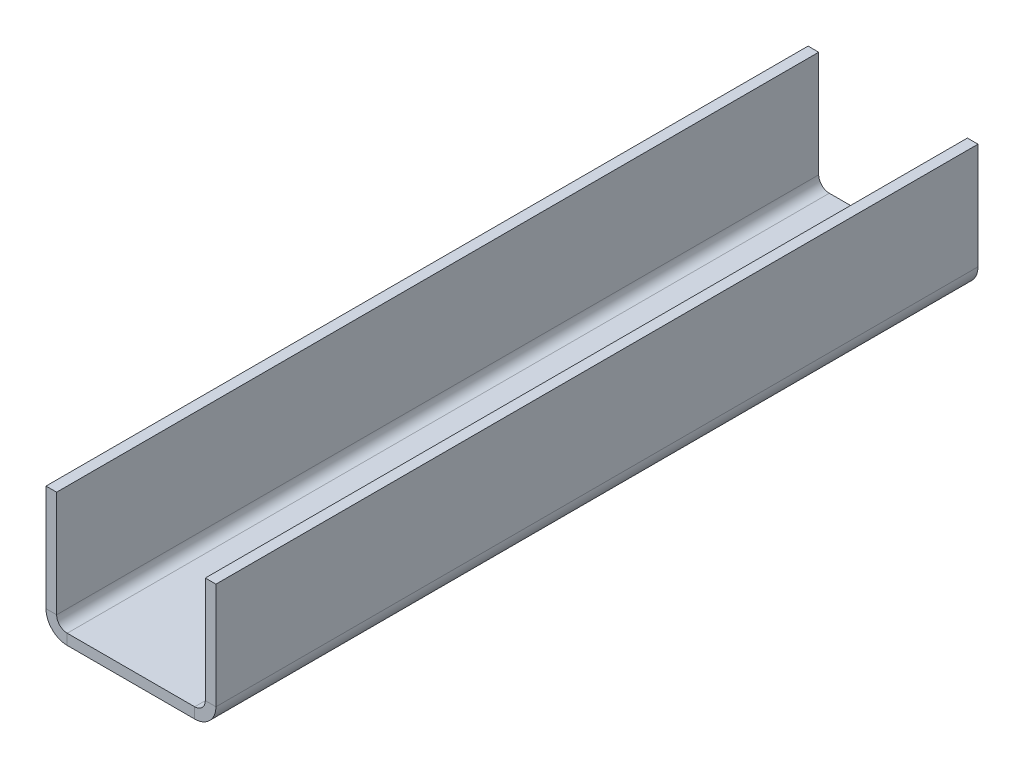
ISO-10303-21;
HEADER;
FILE_DESCRIPTION(('STEP AP214'),'2;1');
FILE_NAME('part.step','',(''),(''),'','','');
FILE_SCHEMA(('AUTOMOTIVE_DESIGN { 1 0 10303 214 1 1 1 1 }'));
ENDSEC;
DATA;
#1=APPLICATION_CONTEXT('core data for automotive mechanical design processes');
#2=APPLICATION_PROTOCOL_DEFINITION('international standard','automotive_design',2000,#1);
#3=PRODUCT_CONTEXT('',#1,'mechanical');
#4=PRODUCT('Part','Part','',(#3));
#5=PRODUCT_RELATED_PRODUCT_CATEGORY('part','',(#4));
#6=PRODUCT_DEFINITION_FORMATION('','',#4);
#7=PRODUCT_DEFINITION_CONTEXT('part definition',#1,'design');
#8=PRODUCT_DEFINITION('design','',#6,#7);
#9=PRODUCT_DEFINITION_SHAPE('','',#8);
#10=(LENGTH_UNIT() NAMED_UNIT(*) SI_UNIT(.MILLI.,.METRE.));
#11=(NAMED_UNIT(*) PLANE_ANGLE_UNIT() SI_UNIT($,.RADIAN.));
#12=(NAMED_UNIT(*) SI_UNIT($,.STERADIAN.) SOLID_ANGLE_UNIT());
#13=UNCERTAINTY_MEASURE_WITH_UNIT(LENGTH_MEASURE(1.E-05),#10,'distance_accuracy_value','');
#14=(GEOMETRIC_REPRESENTATION_CONTEXT(3) GLOBAL_UNCERTAINTY_ASSIGNED_CONTEXT((#13)) GLOBAL_UNIT_ASSIGNED_CONTEXT((#10,
#11,#12)) REPRESENTATION_CONTEXT('',''));
#15=CARTESIAN_POINT('',(0.,0.,0.));
#16=DIRECTION('',(0.,0.,1.));
#17=DIRECTION('',(1.,0.,0.));
#18=AXIS2_PLACEMENT_3D('',#15,#16,#17);
#19=CARTESIAN_POINT('',(0.,6.35,227.838));
#20=DIRECTION('',(0.,0.,1.));
#21=DIRECTION('',(1.,0.,0.));
#22=AXIS2_PLACEMENT_3D('',#19,#20,#21);
#23=PLANE('',#22);
#24=DIRECTION('',(1.,0.,0.));
#25=VECTOR('',#24,1.);
#26=CARTESIAN_POINT('',(0.,6.35,227.838));
#27=LINE('',#26,#25);
#28=CARTESIAN_POINT('',(0.,6.35,227.838));
#29=VERTEX_POINT('',#28);
#30=CARTESIAN_POINT('',(3.175,6.35,227.838));
#31=VERTEX_POINT('',#30);
#32=EDGE_CURVE('E11',#29,#31,#27,.T.);
#33=ORIENTED_EDGE('',*,*,#32,.F.);
#34=CARTESIAN_POINT('',(6.35,6.35,227.838));
#35=DIRECTION('',(0.,0.,-1.));
#36=DIRECTION('',(-1.,0.,0.));
#37=AXIS2_PLACEMENT_3D('',#34,#35,#36);
#38=CIRCLE('',#37,6.35);
#39=CARTESIAN_POINT('',(6.35,0.,227.838));
#40=VERTEX_POINT('',#39);
#41=EDGE_CURVE('E147',#29,#40,#38,.F.);
#42=ORIENTED_EDGE('',*,*,#41,.T.);
#43=DIRECTION('',(0.,-1.,0.));
#44=VECTOR('',#43,1.);
#45=CARTESIAN_POINT('',(6.35,3.175,227.838));
#46=LINE('',#45,#44);
#47=CARTESIAN_POINT('',(6.35,3.175,227.838));
#48=VERTEX_POINT('',#47);
#49=EDGE_CURVE('E45',#48,#40,#46,.T.);
#50=ORIENTED_EDGE('',*,*,#49,.F.);
#51=CARTESIAN_POINT('',(6.35,6.35,227.838));
#52=DIRECTION('',(0.,0.,1.));
#53=DIRECTION('',(1.,0.,0.));
#54=AXIS2_PLACEMENT_3D('',#51,#52,#53);
#55=CIRCLE('',#54,3.175);
#56=EDGE_CURVE('E241',#31,#48,#55,.T.);
#57=ORIENTED_EDGE('',*,*,#56,.F.);
#58=EDGE_LOOP('',(#33,#42,#50,#57));
#59=FACE_BOUND('',#58,.T.);
#60=ADVANCED_FACE('F37',(#59),#23,.T.);
#61=CARTESIAN_POINT('',(6.35,3.175,227.838));
#62=DIRECTION('',(0.,0.,1.));
#63=DIRECTION('',(1.,0.,0.));
#64=AXIS2_PLACEMENT_3D('',#61,#62,#63);
#65=PLANE('',#64);
#66=DIRECTION('',(0.,-1.,0.));
#67=VECTOR('',#66,1.);
#68=CARTESIAN_POINT('',(0.,0.,227.838));
#69=LINE('',#68,#67);
#70=CARTESIAN_POINT('',(0.,38.1,227.838));
#71=VERTEX_POINT('',#70);
#72=EDGE_CURVE('E152',#71,#29,#69,.T.);
#73=ORIENTED_EDGE('',*,*,#72,.T.);
#74=ORIENTED_EDGE('',*,*,#32,.T.);
#75=DIRECTION('',(0.,1.,0.));
#76=VECTOR('',#75,1.);
#77=CARTESIAN_POINT('',(3.175,0.,227.838));
#78=LINE('',#77,#76);
#79=CARTESIAN_POINT('',(3.175,38.1,227.838));
#80=VERTEX_POINT('',#79);
#81=EDGE_CURVE('E254',#80,#31,#78,.F.);
#82=ORIENTED_EDGE('',*,*,#81,.F.);
#83=DIRECTION('',(1.,0.,0.));
#84=VECTOR('',#83,1.);
#85=CARTESIAN_POINT('',(0.,38.1,227.838));
#86=LINE('',#85,#84);
#87=EDGE_CURVE('E256',#71,#80,#86,.T.);
#88=ORIENTED_EDGE('',*,*,#87,.F.);
#89=EDGE_LOOP('',(#73,#74,#82,#88));
#90=FACE_BOUND('',#89,.T.);
#91=ADVANCED_FACE('F267',(#90),#65,.T.);
#92=CARTESIAN_POINT('',(6.35,0.,0.));
#93=DIRECTION('',(0.,0.,-1.));
#94=DIRECTION('',(-1.,0.,0.));
#95=AXIS2_PLACEMENT_3D('',#92,#93,#94);
#96=PLANE('',#95);
#97=DIRECTION('',(0.,1.,0.));
#98=VECTOR('',#97,1.);
#99=CARTESIAN_POINT('',(6.35,0.,0.));
#100=LINE('',#99,#98);
#101=CARTESIAN_POINT('',(6.35,0.,0.));
#102=VERTEX_POINT('',#101);
#103=CARTESIAN_POINT('',(6.35,3.175,0.));
#104=VERTEX_POINT('',#103);
#105=EDGE_CURVE('E145',#102,#104,#100,.T.);
#106=ORIENTED_EDGE('',*,*,#105,.F.);
#107=CARTESIAN_POINT('',(6.35,6.35,0.));
#108=DIRECTION('',(0.,0.,-1.));
#109=DIRECTION('',(-1.,0.,0.));
#110=AXIS2_PLACEMENT_3D('',#107,#108,#109);
#111=CIRCLE('',#110,6.35);
#112=CARTESIAN_POINT('',(0.,6.35,0.));
#113=VERTEX_POINT('',#112);
#114=EDGE_CURVE('E159',#113,#102,#111,.F.);
#115=ORIENTED_EDGE('',*,*,#114,.F.);
#116=DIRECTION('',(-1.,0.,0.));
#117=VECTOR('',#116,1.);
#118=CARTESIAN_POINT('',(3.175,6.35,0.));
#119=LINE('',#118,#117);
#120=CARTESIAN_POINT('',(3.175,6.35,0.));
#121=VERTEX_POINT('',#120);
#122=EDGE_CURVE('E232',#121,#113,#119,.T.);
#123=ORIENTED_EDGE('',*,*,#122,.F.);
#124=CARTESIAN_POINT('',(6.35,6.35,0.));
#125=DIRECTION('',(0.,0.,1.));
#126=DIRECTION('',(1.,0.,0.));
#127=AXIS2_PLACEMENT_3D('',#124,#125,#126);
#128=CIRCLE('',#127,3.175);
#129=EDGE_CURVE('E186',#121,#104,#128,.T.);
#130=ORIENTED_EDGE('',*,*,#129,.T.);
#131=EDGE_LOOP('',(#106,#115,#123,#130));
#132=FACE_BOUND('',#131,.T.);
#133=ADVANCED_FACE('F246',(#132),#96,.T.);
#134=CARTESIAN_POINT('',(3.175,6.35,0.));
#135=DIRECTION('',(0.,0.,-1.));
#136=DIRECTION('',(-1.,0.,0.));
#137=AXIS2_PLACEMENT_3D('',#134,#135,#136);
#138=PLANE('',#137);
#139=DIRECTION('',(1.,0.,0.));
#140=VECTOR('',#139,1.);
#141=CARTESIAN_POINT('',(0.,0.,0.));
#142=LINE('',#141,#140);
#143=CARTESIAN_POINT('',(44.45,0.,0.));
#144=VERTEX_POINT('',#143);
#145=EDGE_CURVE('E199',#102,#144,#142,.T.);
#146=ORIENTED_EDGE('',*,*,#145,.F.);
#147=ORIENTED_EDGE('',*,*,#105,.T.);
#148=DIRECTION('',(1.,0.,0.));
#149=VECTOR('',#148,1.);
#150=CARTESIAN_POINT('',(0.,3.175,0.));
#151=LINE('',#150,#149);
#152=CARTESIAN_POINT('',(44.45,3.175,0.));
#153=VERTEX_POINT('',#152);
#154=EDGE_CURVE('E184',#104,#153,#151,.T.);
#155=ORIENTED_EDGE('',*,*,#154,.T.);
#156=DIRECTION('',(0.,-1.,0.));
#157=VECTOR('',#156,1.);
#158=CARTESIAN_POINT('',(44.45,3.175,0.));
#159=LINE('',#158,#157);
#160=EDGE_CURVE('E94',#153,#144,#159,.T.);
#161=ORIENTED_EDGE('',*,*,#160,.T.);
#162=EDGE_LOOP('',(#146,#147,#155,#161));
#163=FACE_BOUND('',#162,.T.);
#164=ADVANCED_FACE('F234',(#163),#138,.T.);
#165=CARTESIAN_POINT('',(44.45,0.,227.838));
#166=DIRECTION('',(0.,0.,1.));
#167=DIRECTION('',(1.,0.,0.));
#168=AXIS2_PLACEMENT_3D('',#165,#166,#167);
#169=PLANE('',#168);
#170=DIRECTION('',(0.,1.,0.));
#171=VECTOR('',#170,1.);
#172=CARTESIAN_POINT('',(44.45,0.,227.838));
#173=LINE('',#172,#171);
#174=CARTESIAN_POINT('',(44.45,0.,227.838));
#175=VERTEX_POINT('',#174);
#176=CARTESIAN_POINT('',(44.45,3.175,227.838));
#177=VERTEX_POINT('',#176);
#178=EDGE_CURVE('E230',#175,#177,#173,.T.);
#179=ORIENTED_EDGE('',*,*,#178,.F.);
#180=CARTESIAN_POINT('',(44.45,6.35,227.838));
#181=DIRECTION('',(0.,0.,-1.));
#182=DIRECTION('',(-1.,0.,0.));
#183=AXIS2_PLACEMENT_3D('',#180,#181,#182);
#184=CIRCLE('',#183,6.35);
#185=CARTESIAN_POINT('',(50.8,6.35,227.838));
#186=VERTEX_POINT('',#185);
#187=EDGE_CURVE('E167',#175,#186,#184,.F.);
#188=ORIENTED_EDGE('',*,*,#187,.T.);
#189=DIRECTION('',(1.,0.,0.));
#190=VECTOR('',#189,1.);
#191=CARTESIAN_POINT('',(47.625,6.35,227.838));
#192=LINE('',#191,#190);
#193=CARTESIAN_POINT('',(47.625,6.35,227.838));
#194=VERTEX_POINT('',#193);
#195=EDGE_CURVE('E53',#194,#186,#192,.T.);
#196=ORIENTED_EDGE('',*,*,#195,.F.);
#197=CARTESIAN_POINT('',(44.45,6.35,227.838));
#198=DIRECTION('',(0.,0.,1.));
#199=DIRECTION('',(1.,0.,0.));
#200=AXIS2_PLACEMENT_3D('',#197,#198,#199);
#201=CIRCLE('',#200,3.175);
#202=EDGE_CURVE('E258',#177,#194,#201,.T.);
#203=ORIENTED_EDGE('',*,*,#202,.F.);
#204=EDGE_LOOP('',(#179,#188,#196,#203));
#205=FACE_BOUND('',#204,.T.);
#206=ADVANCED_FACE('F293',(#205),#169,.T.);
#207=CARTESIAN_POINT('',(47.625,6.35,227.838));
#208=DIRECTION('',(0.,0.,1.));
#209=DIRECTION('',(1.,0.,0.));
#210=AXIS2_PLACEMENT_3D('',#207,#208,#209);
#211=PLANE('',#210);
#212=DIRECTION('',(1.,0.,0.));
#213=VECTOR('',#212,1.);
#214=CARTESIAN_POINT('',(0.,0.,227.838));
#215=LINE('',#214,#213);
#216=EDGE_CURVE('E137',#40,#175,#215,.T.);
#217=ORIENTED_EDGE('',*,*,#216,.T.);
#218=ORIENTED_EDGE('',*,*,#178,.T.);
#219=DIRECTION('',(1.,0.,0.));
#220=VECTOR('',#219,1.);
#221=CARTESIAN_POINT('',(0.,3.175,227.838));
#222=LINE('',#221,#220);
#223=EDGE_CURVE('E140',#48,#177,#222,.T.);
#224=ORIENTED_EDGE('',*,*,#223,.F.);
#225=ORIENTED_EDGE('',*,*,#49,.T.);
#226=EDGE_LOOP('',(#217,#218,#224,#225));
#227=FACE_BOUND('',#226,.T.);
#228=ADVANCED_FACE('F135',(#227),#211,.T.);
#229=CARTESIAN_POINT('',(50.8,6.35,0.));
#230=DIRECTION('',(0.,0.,-1.));
#231=DIRECTION('',(-1.,0.,0.));
#232=AXIS2_PLACEMENT_3D('',#229,#230,#231);
#233=PLANE('',#232);
#234=DIRECTION('',(-1.,0.,0.));
#235=VECTOR('',#234,1.);
#236=CARTESIAN_POINT('',(50.8,6.35,0.));
#237=LINE('',#236,#235);
#238=CARTESIAN_POINT('',(50.8,6.35,0.));
#239=VERTEX_POINT('',#238);
#240=CARTESIAN_POINT('',(47.625,6.35,0.));
#241=VERTEX_POINT('',#240);
#242=EDGE_CURVE('E101',#239,#241,#237,.T.);
#243=ORIENTED_EDGE('',*,*,#242,.F.);
#244=CARTESIAN_POINT('',(44.45,6.35,0.));
#245=DIRECTION('',(0.,0.,-1.));
#246=DIRECTION('',(-1.,0.,0.));
#247=AXIS2_PLACEMENT_3D('',#244,#245,#246);
#248=CIRCLE('',#247,6.35);
#249=EDGE_CURVE('E201',#144,#239,#248,.F.);
#250=ORIENTED_EDGE('',*,*,#249,.F.);
#251=ORIENTED_EDGE('',*,*,#160,.F.);
#252=CARTESIAN_POINT('',(44.45,6.35,0.));
#253=DIRECTION('',(0.,0.,1.));
#254=DIRECTION('',(1.,0.,0.));
#255=AXIS2_PLACEMENT_3D('',#252,#253,#254);
#256=CIRCLE('',#255,3.175);
#257=EDGE_CURVE('E182',#153,#241,#256,.T.);
#258=ORIENTED_EDGE('',*,*,#257,.T.);
#259=EDGE_LOOP('',(#243,#250,#251,#258));
#260=FACE_BOUND('',#259,.T.);
#261=ADVANCED_FACE('F299',(#260),#233,.T.);
#262=CARTESIAN_POINT('',(44.45,3.175,0.));
#263=DIRECTION('',(0.,0.,-1.));
#264=DIRECTION('',(-1.,0.,0.));
#265=AXIS2_PLACEMENT_3D('',#262,#263,#264);
#266=PLANE('',#265);
#267=DIRECTION('',(0.,1.,0.));
#268=VECTOR('',#267,1.);
#269=CARTESIAN_POINT('',(50.8,0.,0.));
#270=LINE('',#269,#268);
#271=CARTESIAN_POINT('',(50.8,38.1,0.));
#272=VERTEX_POINT('',#271);
#273=EDGE_CURVE('E173',#239,#272,#270,.T.);
#274=ORIENTED_EDGE('',*,*,#273,.F.);
#275=ORIENTED_EDGE('',*,*,#242,.T.);
#276=DIRECTION('',(0.,1.,0.));
#277=VECTOR('',#276,1.);
#278=CARTESIAN_POINT('',(47.625,0.,0.));
#279=LINE('',#278,#277);
#280=CARTESIAN_POINT('',(47.625,38.1,0.));
#281=VERTEX_POINT('',#280);
#282=EDGE_CURVE('E179',#241,#281,#279,.T.);
#283=ORIENTED_EDGE('',*,*,#282,.T.);
#284=DIRECTION('',(1.,0.,0.));
#285=VECTOR('',#284,1.);
#286=CARTESIAN_POINT('',(47.625,38.1,0.));
#287=LINE('',#286,#285);
#288=EDGE_CURVE('E176',#281,#272,#287,.T.);
#289=ORIENTED_EDGE('',*,*,#288,.T.);
#290=EDGE_LOOP('',(#274,#275,#283,#289));
#291=FACE_BOUND('',#290,.T.);
#292=ADVANCED_FACE('F302',(#291),#266,.T.);
#293=CARTESIAN_POINT('',(50.8,0.,227.838));
#294=DIRECTION('',(-1.,0.,0.));
#295=DIRECTION('',(0.,0.,1.));
#296=AXIS2_PLACEMENT_3D('',#293,#294,#295);
#297=PLANE('',#296);
#298=ORIENTED_EDGE('',*,*,#273,.T.);
#299=DIRECTION('',(0.,0.,-1.));
#300=VECTOR('',#299,1.);
#301=CARTESIAN_POINT('',(50.8,38.1,227.838));
#302=LINE('',#301,#300);
#303=CARTESIAN_POINT('',(50.8,38.1,227.838));
#304=VERTEX_POINT('',#303);
#305=EDGE_CURVE('E225',#304,#272,#302,.T.);
#306=ORIENTED_EDGE('',*,*,#305,.F.);
#307=DIRECTION('',(0.,1.,0.));
#308=VECTOR('',#307,1.);
#309=CARTESIAN_POINT('',(50.8,0.,227.838));
#310=LINE('',#309,#308);
#311=EDGE_CURVE('E107',#186,#304,#310,.T.);
#312=ORIENTED_EDGE('',*,*,#311,.F.);
#313=DIRECTION('',(0.,0.,-1.));
#314=VECTOR('',#313,1.);
#315=CARTESIAN_POINT('',(50.8,6.35,227.838));
#316=LINE('',#315,#314);
#317=EDGE_CURVE('E169',#186,#239,#316,.T.);
#318=ORIENTED_EDGE('',*,*,#317,.T.);
#319=EDGE_LOOP('',(#298,#306,#312,#318));
#320=FACE_BOUND('',#319,.T.);
#321=ADVANCED_FACE('F305',(#320),#297,.F.);
#322=CARTESIAN_POINT('',(47.625,38.1,227.838));
#323=DIRECTION('',(0.,1.,0.));
#324=DIRECTION('',(0.,0.,1.));
#325=AXIS2_PLACEMENT_3D('',#322,#323,#324);
#326=PLANE('',#325);
#327=ORIENTED_EDGE('',*,*,#288,.F.);
#328=DIRECTION('',(0.,0.,-1.));
#329=VECTOR('',#328,1.);
#330=CARTESIAN_POINT('',(47.625,38.1,227.838));
#331=LINE('',#330,#329);
#332=CARTESIAN_POINT('',(47.625,38.1,227.838));
#333=VERTEX_POINT('',#332);
#334=EDGE_CURVE('E223',#333,#281,#331,.T.);
#335=ORIENTED_EDGE('',*,*,#334,.F.);
#336=DIRECTION('',(1.,0.,0.));
#337=VECTOR('',#336,1.);
#338=CARTESIAN_POINT('',(47.625,38.1,227.838));
#339=LINE('',#338,#337);
#340=EDGE_CURVE('E513',#333,#304,#339,.T.);
#341=ORIENTED_EDGE('',*,*,#340,.T.);
#342=ORIENTED_EDGE('',*,*,#305,.T.);
#343=EDGE_LOOP('',(#327,#335,#341,#342));
#344=FACE_BOUND('',#343,.T.);
#345=ADVANCED_FACE('F309',(#344),#326,.T.);
#346=CARTESIAN_POINT('',(47.625,0.,227.838));
#347=DIRECTION('',(-1.,0.,0.));
#348=DIRECTION('',(0.,0.,1.));
#349=AXIS2_PLACEMENT_3D('',#346,#347,#348);
#350=PLANE('',#349);
#351=ORIENTED_EDGE('',*,*,#282,.F.);
#352=DIRECTION('',(0.,0.,-1.));
#353=VECTOR('',#352,1.);
#354=CARTESIAN_POINT('',(47.625,6.35,227.838));
#355=LINE('',#354,#353);
#356=EDGE_CURVE('E220',#194,#241,#355,.T.);
#357=ORIENTED_EDGE('',*,*,#356,.F.);
#358=DIRECTION('',(0.,1.,0.));
#359=VECTOR('',#358,1.);
#360=CARTESIAN_POINT('',(47.625,0.,227.838));
#361=LINE('',#360,#359);
#362=EDGE_CURVE('E515',#194,#333,#361,.T.);
#363=ORIENTED_EDGE('',*,*,#362,.T.);
#364=ORIENTED_EDGE('',*,*,#334,.T.);
#365=EDGE_LOOP('',(#351,#357,#363,#364));
#366=FACE_BOUND('',#365,.T.);
#367=ADVANCED_FACE('F313',(#366),#350,.T.);
#368=CARTESIAN_POINT('',(44.45,6.35,227.838));
#369=DIRECTION('',(0.,0.,-1.));
#370=DIRECTION('',(-1.,0.,0.));
#371=AXIS2_PLACEMENT_3D('',#368,#369,#370);
#372=CYLINDRICAL_SURFACE('',#371,3.175);
#373=ORIENTED_EDGE('',*,*,#257,.F.);
#374=DIRECTION('',(0.,0.,-1.));
#375=VECTOR('',#374,1.);
#376=CARTESIAN_POINT('',(44.45,3.175,227.838));
#377=LINE('',#376,#375);
#378=EDGE_CURVE('E217',#177,#153,#377,.T.);
#379=ORIENTED_EDGE('',*,*,#378,.F.);
#380=ORIENTED_EDGE('',*,*,#202,.T.);
#381=ORIENTED_EDGE('',*,*,#356,.T.);
#382=EDGE_LOOP('',(#373,#379,#380,#381));
#383=FACE_BOUND('',#382,.T.);
#384=ADVANCED_FACE('F317',(#383),#372,.F.);
#385=CARTESIAN_POINT('',(0.,3.175,227.838));
#386=DIRECTION('',(0.,1.,0.));
#387=DIRECTION('',(0.,0.,1.));
#388=AXIS2_PLACEMENT_3D('',#385,#386,#387);
#389=PLANE('',#388);
#390=ORIENTED_EDGE('',*,*,#154,.F.);
#391=DIRECTION('',(0.,0.,-1.));
#392=VECTOR('',#391,1.);
#393=CARTESIAN_POINT('',(6.35,3.175,227.838));
#394=LINE('',#393,#392);
#395=EDGE_CURVE('E214',#48,#104,#394,.T.);
#396=ORIENTED_EDGE('',*,*,#395,.F.);
#397=ORIENTED_EDGE('',*,*,#223,.T.);
#398=ORIENTED_EDGE('',*,*,#378,.T.);
#399=EDGE_LOOP('',(#390,#396,#397,#398));
#400=FACE_BOUND('',#399,.T.);
#401=ADVANCED_FACE('F243',(#400),#389,.T.);
#402=CARTESIAN_POINT('',(6.35,6.35,227.838));
#403=DIRECTION('',(0.,0.,-1.));
#404=DIRECTION('',(-1.,0.,0.));
#405=AXIS2_PLACEMENT_3D('',#402,#403,#404);
#406=CYLINDRICAL_SURFACE('',#405,3.175);
#407=ORIENTED_EDGE('',*,*,#129,.F.);
#408=DIRECTION('',(0.,0.,-1.));
#409=VECTOR('',#408,1.);
#410=CARTESIAN_POINT('',(3.175,6.35,227.838));
#411=LINE('',#410,#409);
#412=EDGE_CURVE('E211',#31,#121,#411,.T.);
#413=ORIENTED_EDGE('',*,*,#412,.F.);
#414=ORIENTED_EDGE('',*,*,#56,.T.);
#415=ORIENTED_EDGE('',*,*,#395,.T.);
#416=EDGE_LOOP('',(#407,#413,#414,#415));
#417=FACE_BOUND('',#416,.T.);
#418=ADVANCED_FACE('F239',(#417),#406,.F.);
#419=CARTESIAN_POINT('',(3.175,0.,227.838));
#420=DIRECTION('',(1.,0.,0.));
#421=DIRECTION('',(0.,0.,-1.));
#422=AXIS2_PLACEMENT_3D('',#419,#420,#421);
#423=PLANE('',#422);
#424=DIRECTION('',(0.,1.,0.));
#425=VECTOR('',#424,1.);
#426=CARTESIAN_POINT('',(3.175,0.,0.));
#427=LINE('',#426,#425);
#428=CARTESIAN_POINT('',(3.175,38.1,0.));
#429=VERTEX_POINT('',#428);
#430=EDGE_CURVE('E189',#429,#121,#427,.F.);
#431=ORIENTED_EDGE('',*,*,#430,.F.);
#432=DIRECTION('',(0.,0.,-1.));
#433=VECTOR('',#432,1.);
#434=CARTESIAN_POINT('',(3.175,38.1,227.838));
#435=LINE('',#434,#433);
#436=EDGE_CURVE('E209',#80,#429,#435,.T.);
#437=ORIENTED_EDGE('',*,*,#436,.F.);
#438=ORIENTED_EDGE('',*,*,#81,.T.);
#439=ORIENTED_EDGE('',*,*,#412,.T.);
#440=EDGE_LOOP('',(#431,#437,#438,#439));
#441=FACE_BOUND('',#440,.T.);
#442=ADVANCED_FACE('F252',(#441),#423,.T.);
#443=CARTESIAN_POINT('',(0.,38.1,227.838));
#444=DIRECTION('',(0.,1.,0.));
#445=DIRECTION('',(0.,0.,1.));
#446=AXIS2_PLACEMENT_3D('',#443,#444,#445);
#447=PLANE('',#446);
#448=DIRECTION('',(1.,0.,0.));
#449=VECTOR('',#448,1.);
#450=CARTESIAN_POINT('',(0.,38.1,0.));
#451=LINE('',#450,#449);
#452=CARTESIAN_POINT('',(0.,38.1,0.));
#453=VERTEX_POINT('',#452);
#454=EDGE_CURVE('E192',#453,#429,#451,.T.);
#455=ORIENTED_EDGE('',*,*,#454,.F.);
#456=DIRECTION('',(0.,0.,-1.));
#457=VECTOR('',#456,1.);
#458=CARTESIAN_POINT('',(0.,38.1,227.838));
#459=LINE('',#458,#457);
#460=EDGE_CURVE('E207',#71,#453,#459,.T.);
#461=ORIENTED_EDGE('',*,*,#460,.F.);
#462=ORIENTED_EDGE('',*,*,#87,.T.);
#463=ORIENTED_EDGE('',*,*,#436,.T.);
#464=EDGE_LOOP('',(#455,#461,#462,#463));
#465=FACE_BOUND('',#464,.T.);
#466=ADVANCED_FACE('F273',(#465),#447,.T.);
#467=CARTESIAN_POINT('',(0.,0.,227.838));
#468=DIRECTION('',(1.,0.,0.));
#469=DIRECTION('',(0.,0.,-1.));
#470=AXIS2_PLACEMENT_3D('',#467,#468,#469);
#471=PLANE('',#470);
#472=DIRECTION('',(0.,-1.,0.));
#473=VECTOR('',#472,1.);
#474=CARTESIAN_POINT('',(0.,0.,0.));
#475=LINE('',#474,#473);
#476=EDGE_CURVE('E195',#453,#113,#475,.T.);
#477=ORIENTED_EDGE('',*,*,#476,.T.);
#478=DIRECTION('',(0.,0.,-1.));
#479=VECTOR('',#478,1.);
#480=CARTESIAN_POINT('',(0.,6.35,227.838));
#481=LINE('',#480,#479);
#482=EDGE_CURVE('E161',#29,#113,#481,.T.);
#483=ORIENTED_EDGE('',*,*,#482,.F.);
#484=ORIENTED_EDGE('',*,*,#72,.F.);
#485=ORIENTED_EDGE('',*,*,#460,.T.);
#486=EDGE_LOOP('',(#477,#483,#484,#485));
#487=FACE_BOUND('',#486,.T.);
#488=ADVANCED_FACE('F269',(#487),#471,.F.);
#489=CARTESIAN_POINT('',(6.35,6.35,227.838));
#490=DIRECTION('',(0.,0.,-1.));
#491=DIRECTION('',(-1.,0.,0.));
#492=AXIS2_PLACEMENT_3D('',#489,#490,#491);
#493=CYLINDRICAL_SURFACE('',#492,6.35);
#494=ORIENTED_EDGE('',*,*,#114,.T.);
#495=DIRECTION('',(0.,0.,-1.));
#496=VECTOR('',#495,1.);
#497=CARTESIAN_POINT('',(6.35,0.,227.838));
#498=LINE('',#497,#496);
#499=EDGE_CURVE('E156',#40,#102,#498,.T.);
#500=ORIENTED_EDGE('',*,*,#499,.F.);
#501=ORIENTED_EDGE('',*,*,#41,.F.);
#502=ORIENTED_EDGE('',*,*,#482,.T.);
#503=EDGE_LOOP('',(#494,#500,#501,#502));
#504=FACE_BOUND('',#503,.T.);
#505=ADVANCED_FACE('F157',(#504),#493,.T.);
#506=CARTESIAN_POINT('',(0.,0.,227.838));
#507=DIRECTION('',(0.,1.,0.));
#508=DIRECTION('',(0.,0.,1.));
#509=AXIS2_PLACEMENT_3D('',#506,#507,#508);
#510=PLANE('',#509);
#511=ORIENTED_EDGE('',*,*,#145,.T.);
#512=DIRECTION('',(0.,0.,-1.));
#513=VECTOR('',#512,1.);
#514=CARTESIAN_POINT('',(44.45,0.,227.838));
#515=LINE('',#514,#513);
#516=EDGE_CURVE('E162',#175,#144,#515,.T.);
#517=ORIENTED_EDGE('',*,*,#516,.F.);
#518=ORIENTED_EDGE('',*,*,#216,.F.);
#519=ORIENTED_EDGE('',*,*,#499,.T.);
#520=EDGE_LOOP('',(#511,#517,#518,#519));
#521=FACE_BOUND('',#520,.T.);
#522=ADVANCED_FACE('F164',(#521),#510,.F.);
#523=CARTESIAN_POINT('',(44.45,6.35,227.838));
#524=DIRECTION('',(0.,0.,-1.));
#525=DIRECTION('',(-1.,0.,0.));
#526=AXIS2_PLACEMENT_3D('',#523,#524,#525);
#527=CYLINDRICAL_SURFACE('',#526,6.35);
#528=ORIENTED_EDGE('',*,*,#249,.T.);
#529=ORIENTED_EDGE('',*,*,#317,.F.);
#530=ORIENTED_EDGE('',*,*,#187,.F.);
#531=ORIENTED_EDGE('',*,*,#516,.T.);
#532=EDGE_LOOP('',(#528,#529,#530,#531));
#533=FACE_BOUND('',#532,.T.);
#534=ADVANCED_FACE('F364',(#533),#527,.T.);
#535=CARTESIAN_POINT('',(44.45,6.35,227.838));
#536=DIRECTION('',(0.,0.,1.));
#537=DIRECTION('',(1.,0.,0.));
#538=AXIS2_PLACEMENT_3D('',#535,#536,#537);
#539=PLANE('',#538);
#540=ORIENTED_EDGE('',*,*,#311,.T.);
#541=ORIENTED_EDGE('',*,*,#340,.F.);
#542=ORIENTED_EDGE('',*,*,#362,.F.);
#543=ORIENTED_EDGE('',*,*,#195,.T.);
#544=EDGE_LOOP('',(#540,#541,#542,#543));
#545=FACE_BOUND('',#544,.T.);
#546=ADVANCED_FACE('F374',(#545),#539,.T.);
#547=CARTESIAN_POINT('',(44.45,6.35,0.));
#548=DIRECTION('',(0.,0.,1.));
#549=DIRECTION('',(1.,0.,0.));
#550=AXIS2_PLACEMENT_3D('',#547,#548,#549);
#551=PLANE('',#550);
#552=ORIENTED_EDGE('',*,*,#430,.T.);
#553=ORIENTED_EDGE('',*,*,#122,.T.);
#554=ORIENTED_EDGE('',*,*,#476,.F.);
#555=ORIENTED_EDGE('',*,*,#454,.T.);
#556=EDGE_LOOP('',(#552,#553,#554,#555));
#557=FACE_BOUND('',#556,.T.);
#558=ADVANCED_FACE('F271',(#557),#551,.F.);
#559=CLOSED_SHELL('',(#60,#91,#133,#164,#206,#228,#261,#292,#321,#345,#367,#384,#401,#418,#442,
#466,#488,#505,#522,#534,#546,#558));
#560=MANIFOLD_SOLID_BREP('B2',#559);
#561=ADVANCED_BREP_SHAPE_REPRESENTATION('',(#18,#560),#14);
#562=SHAPE_DEFINITION_REPRESENTATION(#9,#561);
ENDSEC;
END-ISO-10303-21;
